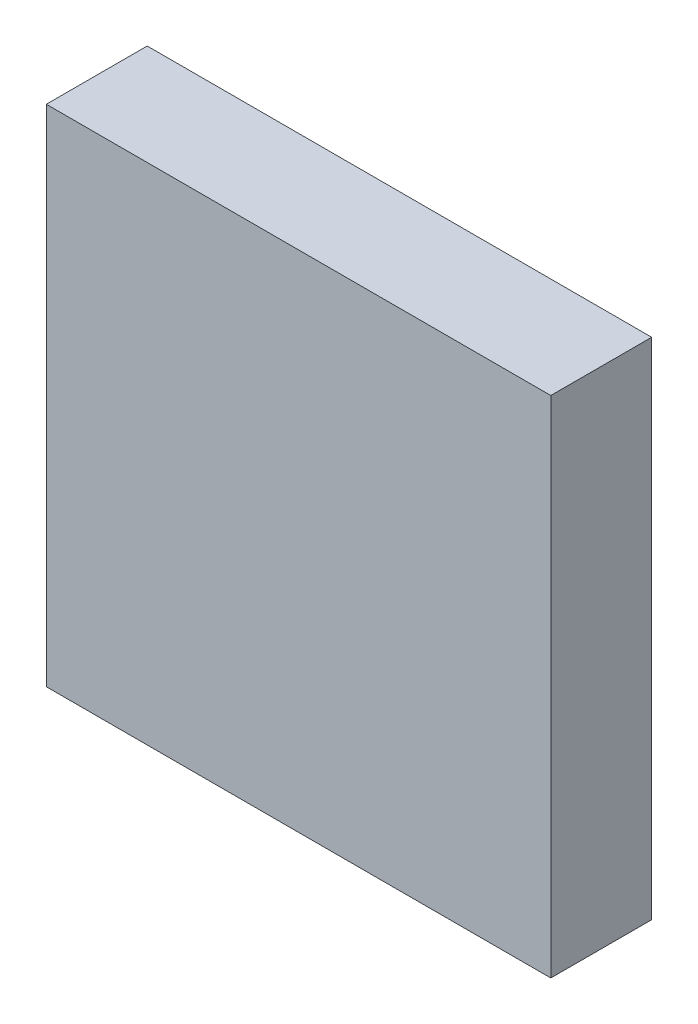
ISO-10303-21;
HEADER;
FILE_DESCRIPTION(('STEP AP214'),'2;1');
FILE_NAME('part.step','',(''),(''),'','','');
FILE_SCHEMA(('AUTOMOTIVE_DESIGN { 1 0 10303 214 1 1 1 1 }'));
ENDSEC;
DATA;
#1=APPLICATION_CONTEXT('core data for automotive mechanical design processes');
#2=APPLICATION_PROTOCOL_DEFINITION('international standard','automotive_design',2000,#1);
#3=PRODUCT_CONTEXT('',#1,'mechanical');
#4=PRODUCT('Part','Part','',(#3));
#5=PRODUCT_RELATED_PRODUCT_CATEGORY('part','',(#4));
#6=PRODUCT_DEFINITION_FORMATION('','',#4);
#7=PRODUCT_DEFINITION_CONTEXT('part definition',#1,'design');
#8=PRODUCT_DEFINITION('design','',#6,#7);
#9=PRODUCT_DEFINITION_SHAPE('','',#8);
#10=(LENGTH_UNIT() NAMED_UNIT(*) SI_UNIT(.MILLI.,.METRE.));
#11=(NAMED_UNIT(*) PLANE_ANGLE_UNIT() SI_UNIT($,.RADIAN.));
#12=(NAMED_UNIT(*) SI_UNIT($,.STERADIAN.) SOLID_ANGLE_UNIT());
#13=UNCERTAINTY_MEASURE_WITH_UNIT(LENGTH_MEASURE(1.E-05),#10,'distance_accuracy_value','');
#14=(GEOMETRIC_REPRESENTATION_CONTEXT(3) GLOBAL_UNCERTAINTY_ASSIGNED_CONTEXT((#13)) GLOBAL_UNIT_ASSIGNED_CONTEXT((#10,
#11,#12)) REPRESENTATION_CONTEXT('',''));
#15=CARTESIAN_POINT('',(0.,0.,0.));
#16=DIRECTION('',(0.,0.,1.));
#17=DIRECTION('',(1.,0.,0.));
#18=AXIS2_PLACEMENT_3D('',#15,#16,#17);
#19=CARTESIAN_POINT('',(500.,1000.,100.));
#20=DIRECTION('',(-1.,0.,0.));
#21=DIRECTION('',(0.,0.,1.));
#22=AXIS2_PLACEMENT_3D('',#19,#20,#21);
#23=PLANE('',#22);
#24=DIRECTION('',(0.,0.,-1.));
#25=VECTOR('',#24,1.);
#26=CARTESIAN_POINT('',(500.,0.,100.));
#27=LINE('',#26,#25);
#28=CARTESIAN_POINT('',(500.,0.,100.));
#29=VERTEX_POINT('',#28);
#30=CARTESIAN_POINT('',(500.,0.,-100.));
#31=VERTEX_POINT('',#30);
#32=EDGE_CURVE('E96',#29,#31,#27,.T.);
#33=ORIENTED_EDGE('',*,*,#32,.T.);
#34=DIRECTION('',(0.,-1.,0.));
#35=VECTOR('',#34,1.);
#36=CARTESIAN_POINT('',(500.,1000.,-100.));
#37=LINE('',#36,#35);
#38=CARTESIAN_POINT('',(500.,1000.,-100.));
#39=VERTEX_POINT('',#38);
#40=EDGE_CURVE('E11',#39,#31,#37,.T.);
#41=ORIENTED_EDGE('',*,*,#40,.F.);
#42=DIRECTION('',(0.,0.,-1.));
#43=VECTOR('',#42,1.);
#44=CARTESIAN_POINT('',(500.,1000.,100.));
#45=LINE('',#44,#43);
#46=CARTESIAN_POINT('',(500.,1000.,100.));
#47=VERTEX_POINT('',#46);
#48=EDGE_CURVE('E84',#47,#39,#45,.T.);
#49=ORIENTED_EDGE('',*,*,#48,.F.);
#50=DIRECTION('',(0.,-1.,0.));
#51=VECTOR('',#50,1.);
#52=CARTESIAN_POINT('',(500.,1000.,100.));
#53=LINE('',#52,#51);
#54=EDGE_CURVE('E92',#47,#29,#53,.T.);
#55=ORIENTED_EDGE('',*,*,#54,.T.);
#56=EDGE_LOOP('',(#33,#41,#49,#55));
#57=FACE_BOUND('',#56,.T.);
#58=ADVANCED_FACE('F33',(#57),#23,.F.);
#59=CARTESIAN_POINT('',(-500.,1000.,-100.));
#60=DIRECTION('',(0.,0.,1.));
#61=DIRECTION('',(1.,0.,0.));
#62=AXIS2_PLACEMENT_3D('',#59,#60,#61);
#63=PLANE('',#62);
#64=DIRECTION('',(-1.,0.,0.));
#65=VECTOR('',#64,1.);
#66=CARTESIAN_POINT('',(-500.,0.,-100.));
#67=LINE('',#66,#65);
#68=CARTESIAN_POINT('',(-500.,0.,-100.));
#69=VERTEX_POINT('',#68);
#70=EDGE_CURVE('E88',#31,#69,#67,.T.);
#71=ORIENTED_EDGE('',*,*,#70,.T.);
#72=DIRECTION('',(0.,-1.,0.));
#73=VECTOR('',#72,1.);
#74=CARTESIAN_POINT('',(-500.,1000.,-100.));
#75=LINE('',#74,#73);
#76=CARTESIAN_POINT('',(-500.,1000.,-100.));
#77=VERTEX_POINT('',#76);
#78=EDGE_CURVE('E41',#77,#69,#75,.T.);
#79=ORIENTED_EDGE('',*,*,#78,.F.);
#80=DIRECTION('',(-1.,0.,0.));
#81=VECTOR('',#80,1.);
#82=CARTESIAN_POINT('',(-500.,1000.,-100.));
#83=LINE('',#82,#81);
#84=EDGE_CURVE('E79',#39,#77,#83,.T.);
#85=ORIENTED_EDGE('',*,*,#84,.F.);
#86=ORIENTED_EDGE('',*,*,#40,.T.);
#87=EDGE_LOOP('',(#71,#79,#85,#86));
#88=FACE_BOUND('',#87,.T.);
#89=ADVANCED_FACE('F87',(#88),#63,.F.);
#90=CARTESIAN_POINT('',(-500.,1000.,100.));
#91=DIRECTION('',(1.,0.,0.));
#92=DIRECTION('',(0.,0.,-1.));
#93=AXIS2_PLACEMENT_3D('',#90,#91,#92);
#94=PLANE('',#93);
#95=DIRECTION('',(0.,0.,1.));
#96=VECTOR('',#95,1.);
#97=CARTESIAN_POINT('',(-500.,0.,100.));
#98=LINE('',#97,#96);
#99=CARTESIAN_POINT('',(-500.,0.,100.));
#100=VERTEX_POINT('',#99);
#101=EDGE_CURVE('E66',#69,#100,#98,.T.);
#102=ORIENTED_EDGE('',*,*,#101,.T.);
#103=DIRECTION('',(0.,-1.,0.));
#104=VECTOR('',#103,1.);
#105=CARTESIAN_POINT('',(-500.,1000.,100.));
#106=LINE('',#105,#104);
#107=CARTESIAN_POINT('',(-500.,1000.,100.));
#108=VERTEX_POINT('',#107);
#109=EDGE_CURVE('E89',#108,#100,#106,.T.);
#110=ORIENTED_EDGE('',*,*,#109,.F.);
#111=DIRECTION('',(0.,0.,1.));
#112=VECTOR('',#111,1.);
#113=CARTESIAN_POINT('',(-500.,1000.,100.));
#114=LINE('',#113,#112);
#115=EDGE_CURVE('E82',#77,#108,#114,.T.);
#116=ORIENTED_EDGE('',*,*,#115,.F.);
#117=ORIENTED_EDGE('',*,*,#78,.T.);
#118=EDGE_LOOP('',(#102,#110,#116,#117));
#119=FACE_BOUND('',#118,.T.);
#120=ADVANCED_FACE('F90',(#119),#94,.F.);
#121=CARTESIAN_POINT('',(-500.,1000.,100.));
#122=DIRECTION('',(0.,0.,-1.));
#123=DIRECTION('',(-1.,0.,0.));
#124=AXIS2_PLACEMENT_3D('',#121,#122,#123);
#125=PLANE('',#124);
#126=DIRECTION('',(1.,0.,0.));
#127=VECTOR('',#126,1.);
#128=CARTESIAN_POINT('',(-500.,0.,100.));
#129=LINE('',#128,#127);
#130=EDGE_CURVE('E72',#100,#29,#129,.T.);
#131=ORIENTED_EDGE('',*,*,#130,.T.);
#132=ORIENTED_EDGE('',*,*,#54,.F.);
#133=DIRECTION('',(1.,0.,0.));
#134=VECTOR('',#133,1.);
#135=CARTESIAN_POINT('',(-500.,1000.,100.));
#136=LINE('',#135,#134);
#137=EDGE_CURVE('E49',#108,#47,#136,.T.);
#138=ORIENTED_EDGE('',*,*,#137,.F.);
#139=ORIENTED_EDGE('',*,*,#109,.T.);
#140=EDGE_LOOP('',(#131,#132,#138,#139));
#141=FACE_BOUND('',#140,.T.);
#142=ADVANCED_FACE('F103',(#141),#125,.F.);
#143=CARTESIAN_POINT('',(0.,1000.,0.));
#144=DIRECTION('',(0.,-1.,0.));
#145=DIRECTION('',(0.,0.,-1.));
#146=AXIS2_PLACEMENT_3D('',#143,#144,#145);
#147=PLANE('',#146);
#148=ORIENTED_EDGE('',*,*,#48,.T.);
#149=ORIENTED_EDGE('',*,*,#84,.T.);
#150=ORIENTED_EDGE('',*,*,#115,.T.);
#151=ORIENTED_EDGE('',*,*,#137,.T.);
#152=EDGE_LOOP('',(#148,#149,#150,#151));
#153=FACE_BOUND('',#152,.T.);
#154=ADVANCED_FACE('F80',(#153),#147,.F.);
#155=CARTESIAN_POINT('',(0.,0.,0.));
#156=DIRECTION('',(0.,-1.,0.));
#157=DIRECTION('',(0.,0.,-1.));
#158=AXIS2_PLACEMENT_3D('',#155,#156,#157);
#159=PLANE('',#158);
#160=ORIENTED_EDGE('',*,*,#32,.F.);
#161=ORIENTED_EDGE('',*,*,#130,.F.);
#162=ORIENTED_EDGE('',*,*,#101,.F.);
#163=ORIENTED_EDGE('',*,*,#70,.F.);
#164=EDGE_LOOP('',(#160,#161,#162,#163));
#165=FACE_BOUND('',#164,.T.);
#166=ADVANCED_FACE('F106',(#165),#159,.T.);
#167=CLOSED_SHELL('',(#58,#89,#120,#142,#154,#166));
#168=MANIFOLD_SOLID_BREP('B2',#167);
#169=ADVANCED_BREP_SHAPE_REPRESENTATION('',(#18,#168),#14);
#170=SHAPE_DEFINITION_REPRESENTATION(#9,#169);
ENDSEC;
END-ISO-10303-21;
